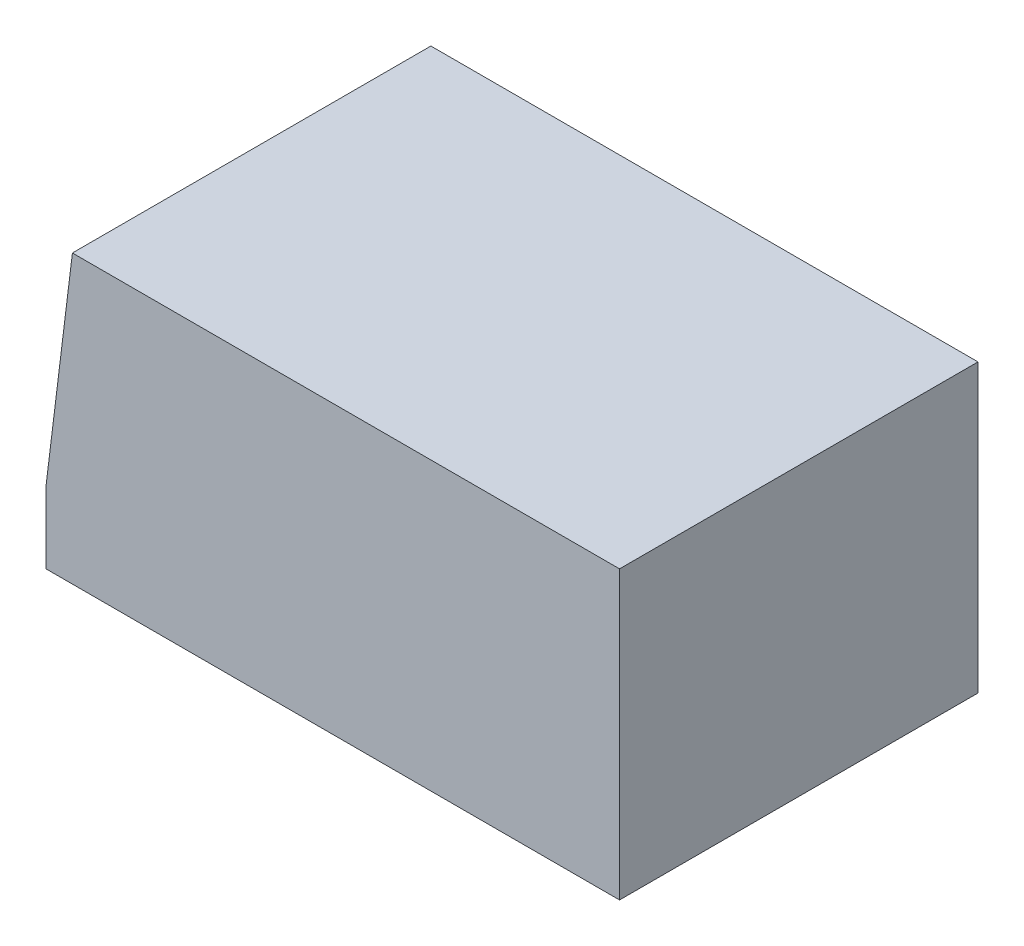
ISO-10303-21;
HEADER;
FILE_DESCRIPTION(('STEP AP214'),'2;1');
FILE_NAME('part.step','',(''),(''),'','','');
FILE_SCHEMA(('AUTOMOTIVE_DESIGN { 1 0 10303 214 1 1 1 1 }'));
ENDSEC;
DATA;
#1=APPLICATION_CONTEXT('core data for automotive mechanical design processes');
#2=APPLICATION_PROTOCOL_DEFINITION('international standard','automotive_design',2000,#1);
#3=PRODUCT_CONTEXT('',#1,'mechanical');
#4=PRODUCT('Part','Part','',(#3));
#5=PRODUCT_RELATED_PRODUCT_CATEGORY('part','',(#4));
#6=PRODUCT_DEFINITION_FORMATION('','',#4);
#7=PRODUCT_DEFINITION_CONTEXT('part definition',#1,'design');
#8=PRODUCT_DEFINITION('design','',#6,#7);
#9=PRODUCT_DEFINITION_SHAPE('','',#8);
#10=(LENGTH_UNIT() NAMED_UNIT(*) SI_UNIT(.MILLI.,.METRE.));
#11=(NAMED_UNIT(*) PLANE_ANGLE_UNIT() SI_UNIT($,.RADIAN.));
#12=(NAMED_UNIT(*) SI_UNIT($,.STERADIAN.) SOLID_ANGLE_UNIT());
#13=UNCERTAINTY_MEASURE_WITH_UNIT(LENGTH_MEASURE(1.E-05),#10,'distance_accuracy_value','');
#14=(GEOMETRIC_REPRESENTATION_CONTEXT(3) GLOBAL_UNCERTAINTY_ASSIGNED_CONTEXT((#13)) GLOBAL_UNIT_ASSIGNED_CONTEXT((#10,
#11,#12)) REPRESENTATION_CONTEXT('',''));
#15=CARTESIAN_POINT('',(0.,0.,0.));
#16=DIRECTION('',(0.,0.,1.));
#17=DIRECTION('',(1.,0.,0.));
#18=AXIS2_PLACEMENT_3D('',#15,#16,#17);
#19=CARTESIAN_POINT('',(40.,40.,25.));
#20=DIRECTION('',(-1.,0.,0.));
#21=DIRECTION('',(0.,0.,1.));
#22=AXIS2_PLACEMENT_3D('',#19,#20,#21);
#23=PLANE('',#22);
#24=DIRECTION('',(0.,0.,-1.));
#25=VECTOR('',#24,1.);
#26=CARTESIAN_POINT('',(40.,0.,25.));
#27=LINE('',#26,#25);
#28=CARTESIAN_POINT('',(40.,0.,25.));
#29=VERTEX_POINT('',#28);
#30=CARTESIAN_POINT('',(40.,0.,-25.));
#31=VERTEX_POINT('',#30);
#32=EDGE_CURVE('E104',#29,#31,#27,.T.);
#33=ORIENTED_EDGE('',*,*,#32,.T.);
#34=DIRECTION('',(0.,-1.,0.));
#35=VECTOR('',#34,1.);
#36=CARTESIAN_POINT('',(40.,40.,-25.));
#37=LINE('',#36,#35);
#38=CARTESIAN_POINT('',(40.,40.,-25.));
#39=VERTEX_POINT('',#38);
#40=EDGE_CURVE('E87',#39,#31,#37,.T.);
#41=ORIENTED_EDGE('',*,*,#40,.F.);
#42=DIRECTION('',(0.,0.,-1.));
#43=VECTOR('',#42,1.);
#44=CARTESIAN_POINT('',(40.,40.,25.));
#45=LINE('',#44,#43);
#46=CARTESIAN_POINT('',(40.,40.,25.));
#47=VERTEX_POINT('',#46);
#48=EDGE_CURVE('E94',#47,#39,#45,.T.);
#49=ORIENTED_EDGE('',*,*,#48,.F.);
#50=DIRECTION('',(0.,-1.,0.));
#51=VECTOR('',#50,1.);
#52=CARTESIAN_POINT('',(40.,40.,25.));
#53=LINE('',#52,#51);
#54=EDGE_CURVE('E114',#47,#29,#53,.T.);
#55=ORIENTED_EDGE('',*,*,#54,.T.);
#56=EDGE_LOOP('',(#33,#41,#49,#55));
#57=FACE_BOUND('',#56,.T.);
#58=ADVANCED_FACE('F37',(#57),#23,.F.);
#59=CARTESIAN_POINT('',(-40.,40.,-25.));
#60=DIRECTION('',(0.,0.,1.));
#61=DIRECTION('',(1.,0.,0.));
#62=AXIS2_PLACEMENT_3D('',#59,#60,#61);
#63=PLANE('',#62);
#64=DIRECTION('',(0.,-1.,0.));
#65=VECTOR('',#64,1.);
#66=CARTESIAN_POINT('',(-40.,40.,-25.));
#67=LINE('',#66,#65);
#68=CARTESIAN_POINT('',(-40.,9.99999999999917,-25.));
#69=VERTEX_POINT('',#68);
#70=CARTESIAN_POINT('',(-40.,0.,-25.));
#71=VERTEX_POINT('',#70);
#72=EDGE_CURVE('E106',#69,#71,#67,.T.);
#73=ORIENTED_EDGE('',*,*,#72,.F.);
#74=DIRECTION('',(-0.121869343405144,-0.992546151641323,0.));
#75=VECTOR('',#74,1.);
#76=CARTESIAN_POINT('',(-36.3164631729129,40.,-25.));
#77=LINE('',#76,#75);
#78=CARTESIAN_POINT('',(-36.3164631729129,40.,-25.));
#79=VERTEX_POINT('',#78);
#80=EDGE_CURVE('E11',#69,#79,#77,.F.);
#81=ORIENTED_EDGE('',*,*,#80,.T.);
#82=DIRECTION('',(-1.,0.,0.));
#83=VECTOR('',#82,1.);
#84=CARTESIAN_POINT('',(-40.,40.,-25.));
#85=LINE('',#84,#83);
#86=EDGE_CURVE('E82',#39,#79,#85,.T.);
#87=ORIENTED_EDGE('',*,*,#86,.F.);
#88=ORIENTED_EDGE('',*,*,#40,.T.);
#89=DIRECTION('',(-1.,0.,0.));
#90=VECTOR('',#89,1.);
#91=CARTESIAN_POINT('',(-40.,0.,-25.));
#92=LINE('',#91,#90);
#93=EDGE_CURVE('E120',#31,#71,#92,.T.);
#94=ORIENTED_EDGE('',*,*,#93,.T.);
#95=EDGE_LOOP('',(#73,#81,#87,#88,#94));
#96=FACE_BOUND('',#95,.T.);
#97=ADVANCED_FACE('F84',(#96),#63,.F.);
#98=CARTESIAN_POINT('',(-40.,40.,25.));
#99=DIRECTION('',(1.,0.,0.));
#100=DIRECTION('',(0.,0.,-1.));
#101=AXIS2_PLACEMENT_3D('',#98,#99,#100);
#102=PLANE('',#101);
#103=DIRECTION('',(0.,-1.,0.));
#104=VECTOR('',#103,1.);
#105=CARTESIAN_POINT('',(-40.,40.,25.));
#106=LINE('',#105,#104);
#107=CARTESIAN_POINT('',(-40.,9.99999999999917,25.));
#108=VERTEX_POINT('',#107);
#109=CARTESIAN_POINT('',(-40.,0.,25.));
#110=VERTEX_POINT('',#109);
#111=EDGE_CURVE('E109',#108,#110,#106,.T.);
#112=ORIENTED_EDGE('',*,*,#111,.F.);
#113=DIRECTION('',(0.,0.,-1.));
#114=VECTOR('',#113,1.);
#115=CARTESIAN_POINT('',(-40.,9.99999999999917,25.));
#116=LINE('',#115,#114);
#117=EDGE_CURVE('E45',#108,#69,#116,.T.);
#118=ORIENTED_EDGE('',*,*,#117,.T.);
#119=ORIENTED_EDGE('',*,*,#72,.T.);
#120=DIRECTION('',(0.,0.,1.));
#121=VECTOR('',#120,1.);
#122=CARTESIAN_POINT('',(-40.,0.,25.));
#123=LINE('',#122,#121);
#124=EDGE_CURVE('E117',#71,#110,#123,.T.);
#125=ORIENTED_EDGE('',*,*,#124,.T.);
#126=EDGE_LOOP('',(#112,#118,#119,#125));
#127=FACE_BOUND('',#126,.T.);
#128=ADVANCED_FACE('F146',(#127),#102,.F.);
#129=CARTESIAN_POINT('',(-40.,40.,25.));
#130=DIRECTION('',(0.,0.,-1.));
#131=DIRECTION('',(-1.,0.,0.));
#132=AXIS2_PLACEMENT_3D('',#129,#130,#131);
#133=PLANE('',#132);
#134=DIRECTION('',(1.,0.,0.));
#135=VECTOR('',#134,1.);
#136=CARTESIAN_POINT('',(-40.,40.,25.));
#137=LINE('',#136,#135);
#138=CARTESIAN_POINT('',(-36.3164631729129,40.,25.));
#139=VERTEX_POINT('',#138);
#140=EDGE_CURVE('E93',#139,#47,#137,.T.);
#141=ORIENTED_EDGE('',*,*,#140,.F.);
#142=DIRECTION('',(0.121869343405144,0.992546151641323,0.));
#143=VECTOR('',#142,1.);
#144=CARTESIAN_POINT('',(-36.3164631729129,40.,25.));
#145=LINE('',#144,#143);
#146=EDGE_CURVE('E59',#139,#108,#145,.F.);
#147=ORIENTED_EDGE('',*,*,#146,.T.);
#148=ORIENTED_EDGE('',*,*,#111,.T.);
#149=DIRECTION('',(1.,0.,0.));
#150=VECTOR('',#149,1.);
#151=CARTESIAN_POINT('',(-40.,0.,25.));
#152=LINE('',#151,#150);
#153=EDGE_CURVE('E101',#110,#29,#152,.T.);
#154=ORIENTED_EDGE('',*,*,#153,.T.);
#155=ORIENTED_EDGE('',*,*,#54,.F.);
#156=EDGE_LOOP('',(#141,#147,#148,#154,#155));
#157=FACE_BOUND('',#156,.T.);
#158=ADVANCED_FACE('F142',(#157),#133,.F.);
#159=CARTESIAN_POINT('',(0.,40.,0.));
#160=DIRECTION('',(0.,-1.,0.));
#161=DIRECTION('',(0.,0.,-1.));
#162=AXIS2_PLACEMENT_3D('',#159,#160,#161);
#163=PLANE('',#162);
#164=ORIENTED_EDGE('',*,*,#86,.T.);
#165=DIRECTION('',(0.,0.,1.));
#166=VECTOR('',#165,1.);
#167=CARTESIAN_POINT('',(-36.3164631729129,40.,0.));
#168=LINE('',#167,#166);
#169=EDGE_CURVE('E105',#79,#139,#168,.T.);
#170=ORIENTED_EDGE('',*,*,#169,.T.);
#171=ORIENTED_EDGE('',*,*,#140,.T.);
#172=ORIENTED_EDGE('',*,*,#48,.T.);
#173=EDGE_LOOP('',(#164,#170,#171,#172));
#174=FACE_BOUND('',#173,.T.);
#175=ADVANCED_FACE('F97',(#174),#163,.F.);
#176=CARTESIAN_POINT('',(0.,0.,0.));
#177=DIRECTION('',(0.,-1.,0.));
#178=DIRECTION('',(0.,0.,-1.));
#179=AXIS2_PLACEMENT_3D('',#176,#177,#178);
#180=PLANE('',#179);
#181=ORIENTED_EDGE('',*,*,#32,.F.);
#182=ORIENTED_EDGE('',*,*,#153,.F.);
#183=ORIENTED_EDGE('',*,*,#124,.F.);
#184=ORIENTED_EDGE('',*,*,#93,.F.);
#185=EDGE_LOOP('',(#181,#182,#183,#184));
#186=FACE_BOUND('',#185,.T.);
#187=ADVANCED_FACE('F141',(#186),#180,.T.);
#188=CARTESIAN_POINT('',(-36.3164631729129,40.,0.));
#189=DIRECTION('',(0.992546151641323,-0.121869343405144,0.));
#190=DIRECTION('',(0.,0.,1.));
#191=AXIS2_PLACEMENT_3D('',#188,#189,#190);
#192=PLANE('',#191);
#193=CARTESIAN_POINT('',(-38.3218154172884,23.6677166116889,0.));
#194=DIRECTION('',(-0.992546151641323,0.121869343405144,0.));
#195=DIRECTION('',(-0.121869343405144,-0.992546151641323,0.));
#196=AXIS2_PLACEMENT_3D('',#193,#194,#195);
#197=CIRCLE('',#196,12.5);
#198=CARTESIAN_POINT('',(-39.8451822098527,11.2608897161724,0.));
#199=VERTEX_POINT('',#198);
#200=EDGE_CURVE('E125',#199,#199,#197,.T.);
#201=ORIENTED_EDGE('',*,*,#200,.F.);
#202=EDGE_LOOP('',(#201));
#203=FACE_BOUND('',#202,.T.);
#204=ORIENTED_EDGE('',*,*,#80,.F.);
#205=ORIENTED_EDGE('',*,*,#117,.F.);
#206=ORIENTED_EDGE('',*,*,#146,.F.);
#207=ORIENTED_EDGE('',*,*,#169,.F.);
#208=EDGE_LOOP('',(#204,#205,#206,#207));
#209=FACE_BOUND('',#208,.T.);
#210=ADVANCED_FACE('F39',(#203,#209),#192,.F.);
#211=CARTESIAN_POINT('',(1.3800306483645,18.7929428754831,0.));
#212=DIRECTION('',(-0.992546151641323,0.121869343405144,0.));
#213=DIRECTION('',(-0.121869343405144,-0.992546151641323,0.));
#214=AXIS2_PLACEMENT_3D('',#211,#212,#213);
#215=CYLINDRICAL_SURFACE('',#214,12.5);
#216=CARTESIAN_POINT('',(1.3800306483645,18.7929428754831,0.));
#217=DIRECTION('',(-0.992546151641323,0.121869343405144,0.));
#218=DIRECTION('',(-0.121869343405144,-0.992546151641323,0.));
#219=AXIS2_PLACEMENT_3D('',#216,#217,#218);
#220=CIRCLE('',#219,12.5);
#221=CARTESIAN_POINT('',(-0.143336144199806,6.38611597996661,0.));
#222=VERTEX_POINT('',#221);
#223=EDGE_CURVE('E123',#222,#222,#220,.T.);
#224=ORIENTED_EDGE('',*,*,#223,.F.);
#225=EDGE_LOOP('',(#224));
#226=FACE_BOUND('',#225,.T.);
#227=ORIENTED_EDGE('',*,*,#200,.T.);
#228=EDGE_LOOP('',(#227));
#229=FACE_BOUND('',#228,.T.);
#230=ADVANCED_FACE('F133',(#226,#229),#215,.F.);
#231=CARTESIAN_POINT('',(1.3800306483645,18.7929428754831,0.));
#232=DIRECTION('',(-0.992546151641323,0.121869343405144,0.));
#233=DIRECTION('',(-0.121869343405144,-0.992546151641323,0.));
#234=AXIS2_PLACEMENT_3D('',#231,#232,#233);
#235=PLANE('',#234);
#236=ORIENTED_EDGE('',*,*,#223,.T.);
#237=EDGE_LOOP('',(#236));
#238=FACE_BOUND('',#237,.T.);
#239=ADVANCED_FACE('F131',(#238),#235,.T.);
#240=CLOSED_SHELL('',(#58,#97,#128,#158,#175,#187,#210,#230,#239));
#241=MANIFOLD_SOLID_BREP('B2',#240);
#242=ADVANCED_BREP_SHAPE_REPRESENTATION('',(#18,#241),#14);
#243=SHAPE_DEFINITION_REPRESENTATION(#9,#242);
ENDSEC;
END-ISO-10303-21;
